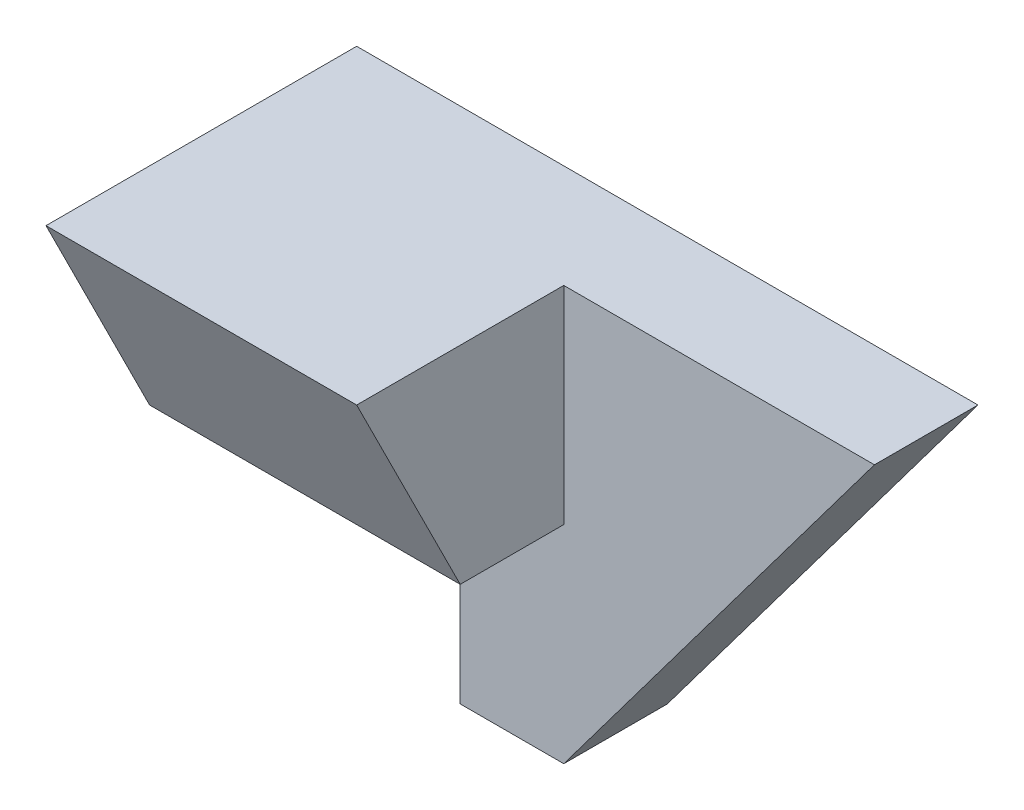
ISO-10303-21;
HEADER;
FILE_DESCRIPTION(('STEP AP214'),'2;1');
FILE_NAME('part.step','',(''),(''),'','','');
FILE_SCHEMA(('AUTOMOTIVE_DESIGN { 1 0 10303 214 1 1 1 1 }'));
ENDSEC;
DATA;
#1=APPLICATION_CONTEXT('core data for automotive mechanical design processes');
#2=APPLICATION_PROTOCOL_DEFINITION('international standard','automotive_design',2000,#1);
#3=PRODUCT_CONTEXT('',#1,'mechanical');
#4=PRODUCT('Part','Part','',(#3));
#5=PRODUCT_RELATED_PRODUCT_CATEGORY('part','',(#4));
#6=PRODUCT_DEFINITION_FORMATION('','',#4);
#7=PRODUCT_DEFINITION_CONTEXT('part definition',#1,'design');
#8=PRODUCT_DEFINITION('design','',#6,#7);
#9=PRODUCT_DEFINITION_SHAPE('','',#8);
#10=(LENGTH_UNIT() NAMED_UNIT(*) SI_UNIT(.MILLI.,.METRE.));
#11=(NAMED_UNIT(*) PLANE_ANGLE_UNIT() SI_UNIT($,.RADIAN.));
#12=(NAMED_UNIT(*) SI_UNIT($,.STERADIAN.) SOLID_ANGLE_UNIT());
#13=UNCERTAINTY_MEASURE_WITH_UNIT(LENGTH_MEASURE(1.E-05),#10,'distance_accuracy_value','');
#14=(GEOMETRIC_REPRESENTATION_CONTEXT(3) GLOBAL_UNCERTAINTY_ASSIGNED_CONTEXT((#13)) GLOBAL_UNIT_ASSIGNED_CONTEXT((#10,
#11,#12)) REPRESENTATION_CONTEXT('',''));
#15=CARTESIAN_POINT('',(0.,0.,0.));
#16=DIRECTION('',(0.,0.,1.));
#17=DIRECTION('',(1.,0.,0.));
#18=AXIS2_PLACEMENT_3D('',#15,#16,#17);
#19=CARTESIAN_POINT('',(0.,0.,10.));
#20=DIRECTION('',(0.,0.,-1.));
#21=DIRECTION('',(-1.,0.,0.));
#22=AXIS2_PLACEMENT_3D('',#19,#20,#21);
#23=PLANE('',#22);
#24=DIRECTION('',(0.,1.,0.));
#25=VECTOR('',#24,1.);
#26=CARTESIAN_POINT('',(30.,-20.,10.));
#27=LINE('',#26,#25);
#28=CARTESIAN_POINT('',(30.,-20.,10.));
#29=VERTEX_POINT('',#28);
#30=CARTESIAN_POINT('',(30.,0.,10.));
#31=VERTEX_POINT('',#30);
#32=EDGE_CURVE('E344',#29,#31,#27,.T.);
#33=ORIENTED_EDGE('',*,*,#32,.F.);
#34=DIRECTION('',(1.,0.,0.));
#35=VECTOR('',#34,1.);
#36=CARTESIAN_POINT('',(0.,-20.,10.));
#37=LINE('',#36,#35);
#38=CARTESIAN_POINT('',(0.,-20.,10.));
#39=VERTEX_POINT('',#38);
#40=EDGE_CURVE('E135',#39,#29,#37,.T.);
#41=ORIENTED_EDGE('',*,*,#40,.F.);
#42=DIRECTION('',(0.,-1.,0.));
#43=VECTOR('',#42,1.);
#44=CARTESIAN_POINT('',(0.,0.,10.));
#45=LINE('',#44,#43);
#46=CARTESIAN_POINT('',(0.,-30.,10.));
#47=VERTEX_POINT('',#46);
#48=EDGE_CURVE('E148',#39,#47,#45,.T.);
#49=ORIENTED_EDGE('',*,*,#48,.T.);
#50=DIRECTION('',(1.,0.,0.));
#51=VECTOR('',#50,1.);
#52=CARTESIAN_POINT('',(0.,-30.,10.));
#53=LINE('',#52,#51);
#54=CARTESIAN_POINT('',(20.,-30.,10.));
#55=VERTEX_POINT('',#54);
#56=EDGE_CURVE('E152',#47,#55,#53,.T.);
#57=ORIENTED_EDGE('',*,*,#56,.T.);
#58=DIRECTION('',(0.,-1.,0.));
#59=VECTOR('',#58,1.);
#60=CARTESIAN_POINT('',(20.,-30.,10.));
#61=LINE('',#60,#59);
#62=CARTESIAN_POINT('',(20.,-40.,10.));
#63=VERTEX_POINT('',#62);
#64=EDGE_CURVE('E155',#55,#63,#61,.T.);
#65=ORIENTED_EDGE('',*,*,#64,.T.);
#66=DIRECTION('',(1.,0.,0.));
#67=VECTOR('',#66,1.);
#68=CARTESIAN_POINT('',(20.,-40.,10.));
#69=LINE('',#68,#67);
#70=CARTESIAN_POINT('',(30.,-40.,10.));
#71=VERTEX_POINT('',#70);
#72=EDGE_CURVE('E158',#63,#71,#69,.T.);
#73=ORIENTED_EDGE('',*,*,#72,.T.);
#74=DIRECTION('',(0.6,0.8,0.));
#75=VECTOR('',#74,1.);
#76=CARTESIAN_POINT('',(60.,0.,10.));
#77=LINE('',#76,#75);
#78=CARTESIAN_POINT('',(60.,0.,10.));
#79=VERTEX_POINT('',#78);
#80=EDGE_CURVE('E161',#71,#79,#77,.T.);
#81=ORIENTED_EDGE('',*,*,#80,.T.);
#82=DIRECTION('',(-1.,0.,0.));
#83=VECTOR('',#82,1.);
#84=CARTESIAN_POINT('',(0.,0.,10.));
#85=LINE('',#84,#83);
#86=EDGE_CURVE('E67',#79,#31,#85,.T.);
#87=ORIENTED_EDGE('',*,*,#86,.T.);
#88=EDGE_LOOP('',(#33,#41,#49,#57,#65,#73,#81,#87));
#89=FACE_BOUND('',#88,.T.);
#90=ADVANCED_FACE('F43',(#89),#23,.F.);
#91=CARTESIAN_POINT('',(0.,0.,10.));
#92=DIRECTION('',(0.,-1.,0.));
#93=DIRECTION('',(0.,0.,-1.));
#94=AXIS2_PLACEMENT_3D('',#91,#92,#93);
#95=PLANE('',#94);
#96=DIRECTION('',(-1.,0.,0.));
#97=VECTOR('',#96,1.);
#98=CARTESIAN_POINT('',(0.,0.,0.));
#99=LINE('',#98,#97);
#100=CARTESIAN_POINT('',(60.,0.,0.));
#101=VERTEX_POINT('',#100);
#102=CARTESIAN_POINT('',(0.,0.,0.));
#103=VERTEX_POINT('',#102);
#104=EDGE_CURVE('E140',#101,#103,#99,.T.);
#105=ORIENTED_EDGE('',*,*,#104,.T.);
#106=DIRECTION('',(0.,0.,-1.));
#107=VECTOR('',#106,1.);
#108=CARTESIAN_POINT('',(0.,0.,10.));
#109=LINE('',#108,#107);
#110=CARTESIAN_POINT('',(0.,0.,30.));
#111=VERTEX_POINT('',#110);
#112=EDGE_CURVE('E11',#111,#103,#109,.T.);
#113=ORIENTED_EDGE('',*,*,#112,.F.);
#114=DIRECTION('',(-1.,0.,0.));
#115=VECTOR('',#114,1.);
#116=CARTESIAN_POINT('',(30.,0.,30.));
#117=LINE('',#116,#115);
#118=CARTESIAN_POINT('',(30.,0.,30.));
#119=VERTEX_POINT('',#118);
#120=EDGE_CURVE('E142',#119,#111,#117,.T.);
#121=ORIENTED_EDGE('',*,*,#120,.F.);
#122=DIRECTION('',(0.,0.,-1.));
#123=VECTOR('',#122,1.);
#124=CARTESIAN_POINT('',(30.,0.,30.));
#125=LINE('',#124,#123);
#126=EDGE_CURVE('E130',#119,#31,#125,.T.);
#127=ORIENTED_EDGE('',*,*,#126,.T.);
#128=ORIENTED_EDGE('',*,*,#86,.F.);
#129=DIRECTION('',(0.,0.,-1.));
#130=VECTOR('',#129,1.);
#131=CARTESIAN_POINT('',(60.,0.,10.));
#132=LINE('',#131,#130);
#133=EDGE_CURVE('E164',#79,#101,#132,.T.);
#134=ORIENTED_EDGE('',*,*,#133,.T.);
#135=EDGE_LOOP('',(#105,#113,#121,#127,#128,#134));
#136=FACE_BOUND('',#135,.T.);
#137=ADVANCED_FACE('F45',(#136),#95,.F.);
#138=CARTESIAN_POINT('',(0.,0.,10.));
#139=DIRECTION('',(1.,0.,0.));
#140=DIRECTION('',(0.,1.,0.));
#141=AXIS2_PLACEMENT_3D('',#138,#139,#140);
#142=PLANE('',#141);
#143=DIRECTION('',(0.,0.,-1.));
#144=VECTOR('',#143,1.);
#145=CARTESIAN_POINT('',(0.,-20.,30.));
#146=LINE('',#145,#144);
#147=CARTESIAN_POINT('',(0.,-20.,20.));
#148=VERTEX_POINT('',#147);
#149=EDGE_CURVE('E59',#148,#39,#146,.T.);
#150=ORIENTED_EDGE('',*,*,#149,.F.);
#151=DIRECTION('',(0.,0.894427190999916,0.447213595499958));
#152=VECTOR('',#151,1.);
#153=CARTESIAN_POINT('',(0.,-8.,26.));
#154=LINE('',#153,#152);
#155=EDGE_CURVE('E122',#148,#111,#154,.T.);
#156=ORIENTED_EDGE('',*,*,#155,.T.);
#157=ORIENTED_EDGE('',*,*,#112,.T.);
#158=DIRECTION('',(0.,-1.,0.));
#159=VECTOR('',#158,1.);
#160=CARTESIAN_POINT('',(0.,0.,0.));
#161=LINE('',#160,#159);
#162=CARTESIAN_POINT('',(0.,-30.,0.));
#163=VERTEX_POINT('',#162);
#164=EDGE_CURVE('E168',#103,#163,#161,.T.);
#165=ORIENTED_EDGE('',*,*,#164,.T.);
#166=DIRECTION('',(0.,0.,-1.));
#167=VECTOR('',#166,1.);
#168=CARTESIAN_POINT('',(0.,-30.,10.));
#169=LINE('',#168,#167);
#170=EDGE_CURVE('E52',#47,#163,#169,.T.);
#171=ORIENTED_EDGE('',*,*,#170,.F.);
#172=ORIENTED_EDGE('',*,*,#48,.F.);
#173=EDGE_LOOP('',(#150,#156,#157,#165,#171,#172));
#174=FACE_BOUND('',#173,.T.);
#175=ADVANCED_FACE('F222',(#174),#142,.F.);
#176=CARTESIAN_POINT('',(0.,-30.,10.));
#177=DIRECTION('',(0.,1.,0.));
#178=DIRECTION('',(0.,0.,1.));
#179=AXIS2_PLACEMENT_3D('',#176,#177,#178);
#180=PLANE('',#179);
#181=DIRECTION('',(1.,0.,0.));
#182=VECTOR('',#181,1.);
#183=CARTESIAN_POINT('',(0.,-30.,0.));
#184=LINE('',#183,#182);
#185=CARTESIAN_POINT('',(20.,-30.,0.));
#186=VERTEX_POINT('',#185);
#187=EDGE_CURVE('E171',#163,#186,#184,.T.);
#188=ORIENTED_EDGE('',*,*,#187,.T.);
#189=DIRECTION('',(0.,0.,-1.));
#190=VECTOR('',#189,1.);
#191=CARTESIAN_POINT('',(20.,-30.,10.));
#192=LINE('',#191,#190);
#193=EDGE_CURVE('E193',#55,#186,#192,.T.);
#194=ORIENTED_EDGE('',*,*,#193,.F.);
#195=ORIENTED_EDGE('',*,*,#56,.F.);
#196=ORIENTED_EDGE('',*,*,#170,.T.);
#197=EDGE_LOOP('',(#188,#194,#195,#196));
#198=FACE_BOUND('',#197,.T.);
#199=ADVANCED_FACE('F202',(#198),#180,.F.);
#200=CARTESIAN_POINT('',(20.,-30.,10.));
#201=DIRECTION('',(1.,0.,0.));
#202=DIRECTION('',(0.,0.,-1.));
#203=AXIS2_PLACEMENT_3D('',#200,#201,#202);
#204=PLANE('',#203);
#205=DIRECTION('',(0.,-1.,0.));
#206=VECTOR('',#205,1.);
#207=CARTESIAN_POINT('',(20.,-30.,0.));
#208=LINE('',#207,#206);
#209=CARTESIAN_POINT('',(20.,-40.,0.));
#210=VERTEX_POINT('',#209);
#211=EDGE_CURVE('E174',#186,#210,#208,.T.);
#212=ORIENTED_EDGE('',*,*,#211,.T.);
#213=DIRECTION('',(0.,0.,-1.));
#214=VECTOR('',#213,1.);
#215=CARTESIAN_POINT('',(20.,-40.,10.));
#216=LINE('',#215,#214);
#217=EDGE_CURVE('E189',#63,#210,#216,.T.);
#218=ORIENTED_EDGE('',*,*,#217,.F.);
#219=ORIENTED_EDGE('',*,*,#64,.F.);
#220=ORIENTED_EDGE('',*,*,#193,.T.);
#221=EDGE_LOOP('',(#212,#218,#219,#220));
#222=FACE_BOUND('',#221,.T.);
#223=ADVANCED_FACE('F214',(#222),#204,.F.);
#224=CARTESIAN_POINT('',(20.,-40.,10.));
#225=DIRECTION('',(0.,1.,0.));
#226=DIRECTION('',(0.,0.,1.));
#227=AXIS2_PLACEMENT_3D('',#224,#225,#226);
#228=PLANE('',#227);
#229=DIRECTION('',(1.,0.,0.));
#230=VECTOR('',#229,1.);
#231=CARTESIAN_POINT('',(20.,-40.,0.));
#232=LINE('',#231,#230);
#233=CARTESIAN_POINT('',(30.,-40.,0.));
#234=VERTEX_POINT('',#233);
#235=EDGE_CURVE('E177',#210,#234,#232,.T.);
#236=ORIENTED_EDGE('',*,*,#235,.T.);
#237=DIRECTION('',(0.,0.,-1.));
#238=VECTOR('',#237,1.);
#239=CARTESIAN_POINT('',(30.,-40.,10.));
#240=LINE('',#239,#238);
#241=EDGE_CURVE('E185',#71,#234,#240,.T.);
#242=ORIENTED_EDGE('',*,*,#241,.F.);
#243=ORIENTED_EDGE('',*,*,#72,.F.);
#244=ORIENTED_EDGE('',*,*,#217,.T.);
#245=EDGE_LOOP('',(#236,#242,#243,#244));
#246=FACE_BOUND('',#245,.T.);
#247=ADVANCED_FACE('F218',(#246),#228,.F.);
#248=CARTESIAN_POINT('',(60.,0.,10.));
#249=DIRECTION('',(-0.8,0.6,0.));
#250=DIRECTION('',(-0.6,-0.8,0.));
#251=AXIS2_PLACEMENT_3D('',#248,#249,#250);
#252=PLANE('',#251);
#253=DIRECTION('',(0.6,0.8,0.));
#254=VECTOR('',#253,1.);
#255=CARTESIAN_POINT('',(60.,0.,0.));
#256=LINE('',#255,#254);
#257=EDGE_CURVE('E149',#234,#101,#256,.T.);
#258=ORIENTED_EDGE('',*,*,#257,.T.);
#259=ORIENTED_EDGE('',*,*,#133,.F.);
#260=ORIENTED_EDGE('',*,*,#80,.F.);
#261=ORIENTED_EDGE('',*,*,#241,.T.);
#262=EDGE_LOOP('',(#258,#259,#260,#261));
#263=FACE_BOUND('',#262,.T.);
#264=ADVANCED_FACE('F228',(#263),#252,.F.);
#265=CARTESIAN_POINT('',(0.,0.,0.));
#266=DIRECTION('',(0.,0.,-1.));
#267=DIRECTION('',(-1.,0.,0.));
#268=AXIS2_PLACEMENT_3D('',#265,#266,#267);
#269=PLANE('',#268);
#270=ORIENTED_EDGE('',*,*,#104,.F.);
#271=ORIENTED_EDGE('',*,*,#257,.F.);
#272=ORIENTED_EDGE('',*,*,#235,.F.);
#273=ORIENTED_EDGE('',*,*,#211,.F.);
#274=ORIENTED_EDGE('',*,*,#187,.F.);
#275=ORIENTED_EDGE('',*,*,#164,.F.);
#276=EDGE_LOOP('',(#270,#271,#272,#273,#274,#275));
#277=FACE_BOUND('',#276,.T.);
#278=ADVANCED_FACE('F209',(#277),#269,.T.);
#279=CARTESIAN_POINT('',(0.,-20.,30.));
#280=DIRECTION('',(0.,1.,0.));
#281=DIRECTION('',(0.,0.,1.));
#282=AXIS2_PLACEMENT_3D('',#279,#280,#281);
#283=PLANE('',#282);
#284=DIRECTION('',(0.,0.,-1.));
#285=VECTOR('',#284,1.);
#286=CARTESIAN_POINT('',(30.,-20.,30.));
#287=LINE('',#286,#285);
#288=CARTESIAN_POINT('',(30.,-20.,20.));
#289=VERTEX_POINT('',#288);
#290=EDGE_CURVE('E128',#289,#29,#287,.T.);
#291=ORIENTED_EDGE('',*,*,#290,.F.);
#292=DIRECTION('',(1.,0.,0.));
#293=VECTOR('',#292,1.);
#294=CARTESIAN_POINT('',(-13.,-20.,20.));
#295=LINE('',#294,#293);
#296=EDGE_CURVE('E116',#148,#289,#295,.T.);
#297=ORIENTED_EDGE('',*,*,#296,.F.);
#298=ORIENTED_EDGE('',*,*,#149,.T.);
#299=ORIENTED_EDGE('',*,*,#40,.T.);
#300=EDGE_LOOP('',(#291,#297,#298,#299));
#301=FACE_BOUND('',#300,.T.);
#302=ADVANCED_FACE('F134',(#301),#283,.F.);
#303=CARTESIAN_POINT('',(30.,-20.,30.));
#304=DIRECTION('',(-1.,0.,0.));
#305=DIRECTION('',(0.,0.,1.));
#306=AXIS2_PLACEMENT_3D('',#303,#304,#305);
#307=PLANE('',#306);
#308=ORIENTED_EDGE('',*,*,#126,.F.);
#309=DIRECTION('',(0.,0.894427190999916,0.447213595499958));
#310=VECTOR('',#309,1.);
#311=CARTESIAN_POINT('',(30.,-20.,20.));
#312=LINE('',#311,#310);
#313=EDGE_CURVE('E119',#289,#119,#312,.T.);
#314=ORIENTED_EDGE('',*,*,#313,.F.);
#315=ORIENTED_EDGE('',*,*,#290,.T.);
#316=ORIENTED_EDGE('',*,*,#32,.T.);
#317=EDGE_LOOP('',(#308,#314,#315,#316));
#318=FACE_BOUND('',#317,.T.);
#319=ADVANCED_FACE('F127',(#318),#307,.F.);
#320=CARTESIAN_POINT('',(-13.,-20.,20.));
#321=DIRECTION('',(0.,0.447213595499958,-0.894427190999916));
#322=DIRECTION('',(0.,0.894427190999916,0.447213595499958));
#323=AXIS2_PLACEMENT_3D('',#320,#321,#322);
#324=PLANE('',#323);
#325=ORIENTED_EDGE('',*,*,#296,.T.);
#326=ORIENTED_EDGE('',*,*,#313,.T.);
#327=ORIENTED_EDGE('',*,*,#120,.T.);
#328=ORIENTED_EDGE('',*,*,#155,.F.);
#329=EDGE_LOOP('',(#325,#326,#327,#328));
#330=FACE_BOUND('',#329,.T.);
#331=ADVANCED_FACE('F118',(#330),#324,.F.);
#332=CLOSED_SHELL('',(#90,#137,#175,#199,#223,#247,#264,#278,#302,#319,#331));
#333=MANIFOLD_SOLID_BREP('B2',#332);
#334=ADVANCED_BREP_SHAPE_REPRESENTATION('',(#18,#333),#14);
#335=SHAPE_DEFINITION_REPRESENTATION(#9,#334);
ENDSEC;
END-ISO-10303-21;
